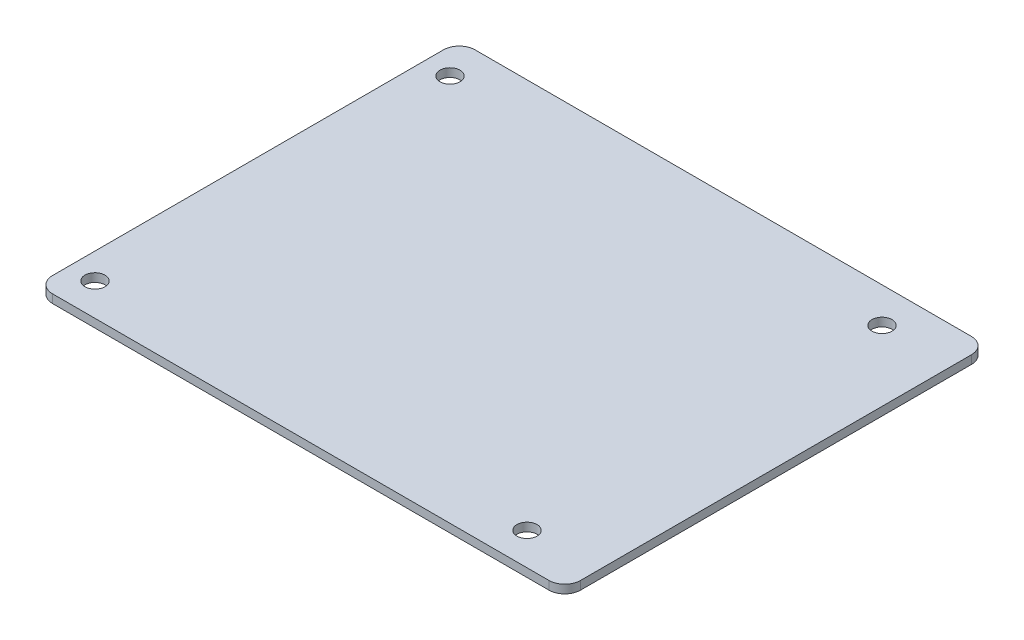
ISO-10303-21;
HEADER;
FILE_DESCRIPTION(('STEP AP214'),'2;1');
FILE_NAME('part.step','',(''),(''),'','','');
FILE_SCHEMA(('AUTOMOTIVE_DESIGN { 1 0 10303 214 1 1 1 1 }'));
ENDSEC;
DATA;
#1=APPLICATION_CONTEXT('core data for automotive mechanical design processes');
#2=APPLICATION_PROTOCOL_DEFINITION('international standard','automotive_design',2000,#1);
#3=PRODUCT_CONTEXT('',#1,'mechanical');
#4=PRODUCT('Part','Part','',(#3));
#5=PRODUCT_RELATED_PRODUCT_CATEGORY('part','',(#4));
#6=PRODUCT_DEFINITION_FORMATION('','',#4);
#7=PRODUCT_DEFINITION_CONTEXT('part definition',#1,'design');
#8=PRODUCT_DEFINITION('design','',#6,#7);
#9=PRODUCT_DEFINITION_SHAPE('','',#8);
#10=(LENGTH_UNIT() NAMED_UNIT(*) SI_UNIT(.MILLI.,.METRE.));
#11=(NAMED_UNIT(*) PLANE_ANGLE_UNIT() SI_UNIT($,.RADIAN.));
#12=(NAMED_UNIT(*) SI_UNIT($,.STERADIAN.) SOLID_ANGLE_UNIT());
#13=UNCERTAINTY_MEASURE_WITH_UNIT(LENGTH_MEASURE(1.E-05),#10,'distance_accuracy_value','');
#14=(GEOMETRIC_REPRESENTATION_CONTEXT(3) GLOBAL_UNCERTAINTY_ASSIGNED_CONTEXT((#13)) GLOBAL_UNIT_ASSIGNED_CONTEXT((#10,
#11,#12)) REPRESENTATION_CONTEXT('',''));
#15=CARTESIAN_POINT('',(0.,0.,0.));
#16=DIRECTION('',(0.,0.,1.));
#17=DIRECTION('',(1.,0.,0.));
#18=AXIS2_PLACEMENT_3D('',#15,#16,#17);
#19=CARTESIAN_POINT('',(-50.06,0.8,40.06));
#20=DIRECTION('',(1.,0.,0.));
#21=DIRECTION('',(0.,0.,-1.));
#22=AXIS2_PLACEMENT_3D('',#19,#20,#21);
#23=PLANE('',#22);
#24=DIRECTION('',(0.,0.,1.));
#25=VECTOR('',#24,1.);
#26=CARTESIAN_POINT('',(-50.06,0.8,40.06));
#27=LINE('',#26,#25);
#28=CARTESIAN_POINT('',(-50.06,0.8,-37.06));
#29=VERTEX_POINT('',#28);
#30=CARTESIAN_POINT('',(-50.06,0.8,37.06));
#31=VERTEX_POINT('',#30);
#32=EDGE_CURVE('E132',#29,#31,#27,.T.);
#33=ORIENTED_EDGE('',*,*,#32,.F.);
#34=DIRECTION('',(0.,-1.,0.));
#35=VECTOR('',#34,1.);
#36=CARTESIAN_POINT('',(-50.06,0.8,-37.06));
#37=LINE('',#36,#35);
#38=CARTESIAN_POINT('',(-50.06,-0.8,-37.06));
#39=VERTEX_POINT('',#38);
#40=EDGE_CURVE('E116',#29,#39,#37,.T.);
#41=ORIENTED_EDGE('',*,*,#40,.T.);
#42=DIRECTION('',(0.,0.,1.));
#43=VECTOR('',#42,1.);
#44=CARTESIAN_POINT('',(-50.06,-0.8,40.06));
#45=LINE('',#44,#43);
#46=CARTESIAN_POINT('',(-50.06,-0.8,37.06));
#47=VERTEX_POINT('',#46);
#48=EDGE_CURVE('E129',#39,#47,#45,.T.);
#49=ORIENTED_EDGE('',*,*,#48,.T.);
#50=DIRECTION('',(0.,-1.,0.));
#51=VECTOR('',#50,1.);
#52=CARTESIAN_POINT('',(-50.06,0.8,37.06));
#53=LINE('',#52,#51);
#54=EDGE_CURVE('E135',#47,#31,#53,.F.);
#55=ORIENTED_EDGE('',*,*,#54,.T.);
#56=EDGE_LOOP('',(#33,#41,#49,#55));
#57=FACE_BOUND('',#56,.T.);
#58=ADVANCED_FACE('F45',(#57),#23,.F.);
#59=CARTESIAN_POINT('',(50.06,0.8,40.06));
#60=DIRECTION('',(0.,0.,-1.));
#61=DIRECTION('',(-1.,0.,0.));
#62=AXIS2_PLACEMENT_3D('',#59,#60,#61);
#63=PLANE('',#62);
#64=DIRECTION('',(1.,0.,0.));
#65=VECTOR('',#64,1.);
#66=CARTESIAN_POINT('',(50.06,-0.8,40.06));
#67=LINE('',#66,#65);
#68=CARTESIAN_POINT('',(-47.06,-0.8,40.06));
#69=VERTEX_POINT('',#68);
#70=CARTESIAN_POINT('',(47.06,-0.8,40.06));
#71=VERTEX_POINT('',#70);
#72=EDGE_CURVE('E140',#69,#71,#67,.T.);
#73=ORIENTED_EDGE('',*,*,#72,.T.);
#74=DIRECTION('',(0.,-1.,0.));
#75=VECTOR('',#74,1.);
#76=CARTESIAN_POINT('',(47.06,0.8,40.06));
#77=LINE('',#76,#75);
#78=CARTESIAN_POINT('',(47.06,0.8,40.06));
#79=VERTEX_POINT('',#78);
#80=EDGE_CURVE('E11',#71,#79,#77,.F.);
#81=ORIENTED_EDGE('',*,*,#80,.T.);
#82=DIRECTION('',(1.,0.,0.));
#83=VECTOR('',#82,1.);
#84=CARTESIAN_POINT('',(50.06,0.8,40.06));
#85=LINE('',#84,#83);
#86=CARTESIAN_POINT('',(-47.06,0.8,40.06));
#87=VERTEX_POINT('',#86);
#88=EDGE_CURVE('E197',#87,#79,#85,.T.);
#89=ORIENTED_EDGE('',*,*,#88,.F.);
#90=DIRECTION('',(0.,-1.,0.));
#91=VECTOR('',#90,1.);
#92=CARTESIAN_POINT('',(-47.06,0.8,40.06));
#93=LINE('',#92,#91);
#94=EDGE_CURVE('E54',#87,#69,#93,.T.);
#95=ORIENTED_EDGE('',*,*,#94,.T.);
#96=EDGE_LOOP('',(#73,#81,#89,#95));
#97=FACE_BOUND('',#96,.T.);
#98=ADVANCED_FACE('F195',(#97),#63,.F.);
#99=CARTESIAN_POINT('',(50.06,0.8,40.06));
#100=DIRECTION('',(-1.,0.,0.));
#101=DIRECTION('',(0.,0.,1.));
#102=AXIS2_PLACEMENT_3D('',#99,#100,#101);
#103=PLANE('',#102);
#104=DIRECTION('',(0.,0.,-1.));
#105=VECTOR('',#104,1.);
#106=CARTESIAN_POINT('',(50.06,-0.8,40.06));
#107=LINE('',#106,#105);
#108=CARTESIAN_POINT('',(50.06,-0.8,37.06));
#109=VERTEX_POINT('',#108);
#110=CARTESIAN_POINT('',(50.06,-0.8,-37.06));
#111=VERTEX_POINT('',#110);
#112=EDGE_CURVE('E146',#109,#111,#107,.T.);
#113=ORIENTED_EDGE('',*,*,#112,.T.);
#114=DIRECTION('',(0.,-1.,0.));
#115=VECTOR('',#114,1.);
#116=CARTESIAN_POINT('',(50.06,0.8,-37.06));
#117=LINE('',#116,#115);
#118=CARTESIAN_POINT('',(50.06,0.8,-37.06));
#119=VERTEX_POINT('',#118);
#120=EDGE_CURVE('E61',#111,#119,#117,.F.);
#121=ORIENTED_EDGE('',*,*,#120,.T.);
#122=DIRECTION('',(0.,0.,-1.));
#123=VECTOR('',#122,1.);
#124=CARTESIAN_POINT('',(50.06,0.8,40.06));
#125=LINE('',#124,#123);
#126=CARTESIAN_POINT('',(50.06,0.8,37.06));
#127=VERTEX_POINT('',#126);
#128=EDGE_CURVE('E205',#127,#119,#125,.T.);
#129=ORIENTED_EDGE('',*,*,#128,.F.);
#130=DIRECTION('',(0.,-1.,0.));
#131=VECTOR('',#130,1.);
#132=CARTESIAN_POINT('',(50.06,0.8,37.06));
#133=LINE('',#132,#131);
#134=EDGE_CURVE('E185',#127,#109,#133,.T.);
#135=ORIENTED_EDGE('',*,*,#134,.T.);
#136=EDGE_LOOP('',(#113,#121,#129,#135));
#137=FACE_BOUND('',#136,.T.);
#138=ADVANCED_FACE('F204',(#137),#103,.F.);
#139=CARTESIAN_POINT('',(50.06,0.8,-40.06));
#140=DIRECTION('',(0.,0.,1.));
#141=DIRECTION('',(1.,0.,0.));
#142=AXIS2_PLACEMENT_3D('',#139,#140,#141);
#143=PLANE('',#142);
#144=DIRECTION('',(-1.,0.,0.));
#145=VECTOR('',#144,1.);
#146=CARTESIAN_POINT('',(50.06,-0.8,-40.06));
#147=LINE('',#146,#145);
#148=CARTESIAN_POINT('',(47.06,-0.8,-40.06));
#149=VERTEX_POINT('',#148);
#150=CARTESIAN_POINT('',(-47.06,-0.8,-40.06));
#151=VERTEX_POINT('',#150);
#152=EDGE_CURVE('E157',#149,#151,#147,.T.);
#153=ORIENTED_EDGE('',*,*,#152,.T.);
#154=DIRECTION('',(0.,-1.,0.));
#155=VECTOR('',#154,1.);
#156=CARTESIAN_POINT('',(-47.06,0.8,-40.06));
#157=LINE('',#156,#155);
#158=CARTESIAN_POINT('',(-47.06,0.8,-40.06));
#159=VERTEX_POINT('',#158);
#160=EDGE_CURVE('E117',#151,#159,#157,.F.);
#161=ORIENTED_EDGE('',*,*,#160,.T.);
#162=DIRECTION('',(-1.,0.,0.));
#163=VECTOR('',#162,1.);
#164=CARTESIAN_POINT('',(50.06,0.8,-40.06));
#165=LINE('',#164,#163);
#166=CARTESIAN_POINT('',(47.06,0.8,-40.06));
#167=VERTEX_POINT('',#166);
#168=EDGE_CURVE('E152',#167,#159,#165,.T.);
#169=ORIENTED_EDGE('',*,*,#168,.F.);
#170=DIRECTION('',(0.,-1.,0.));
#171=VECTOR('',#170,1.);
#172=CARTESIAN_POINT('',(47.06,0.8,-40.06));
#173=LINE('',#172,#171);
#174=EDGE_CURVE('E123',#167,#149,#173,.T.);
#175=ORIENTED_EDGE('',*,*,#174,.T.);
#176=EDGE_LOOP('',(#153,#161,#169,#175));
#177=FACE_BOUND('',#176,.T.);
#178=ADVANCED_FACE('F294',(#177),#143,.F.);
#179=CARTESIAN_POINT('',(0.,0.8,0.));
#180=DIRECTION('',(0.,1.,0.));
#181=DIRECTION('',(0.,0.,1.));
#182=AXIS2_PLACEMENT_3D('',#179,#180,#181);
#183=PLANE('',#182);
#184=CARTESIAN_POINT('',(36.76,0.8,-33.3925));
#185=DIRECTION('',(0.,1.,0.));
#186=DIRECTION('',(0.,0.,1.));
#187=AXIS2_PLACEMENT_3D('',#184,#185,#186);
#188=CIRCLE('',#187,1.905);
#189=CARTESIAN_POINT('',(36.76,0.8,-31.4875));
#190=VERTEX_POINT('',#189);
#191=EDGE_CURVE('E219',#190,#190,#188,.T.);
#192=ORIENTED_EDGE('',*,*,#191,.F.);
#193=EDGE_LOOP('',(#192));
#194=FACE_BOUND('',#193,.T.);
#195=CARTESIAN_POINT('',(36.76,0.8,33.9175));
#196=DIRECTION('',(0.,1.,0.));
#197=DIRECTION('',(0.,0.,1.));
#198=AXIS2_PLACEMENT_3D('',#195,#196,#197);
#199=CIRCLE('',#198,1.905);
#200=CARTESIAN_POINT('',(36.76,0.8,35.8225));
#201=VERTEX_POINT('',#200);
#202=EDGE_CURVE('E228',#201,#201,#199,.T.);
#203=ORIENTED_EDGE('',*,*,#202,.F.);
#204=EDGE_LOOP('',(#203));
#205=FACE_BOUND('',#204,.T.);
#206=CARTESIAN_POINT('',(-45.155,0.8,33.9175));
#207=DIRECTION('',(0.,1.,0.));
#208=DIRECTION('',(0.,0.,1.));
#209=AXIS2_PLACEMENT_3D('',#206,#207,#208);
#210=CIRCLE('',#209,1.905);
#211=CARTESIAN_POINT('',(-45.155,0.8,35.8225));
#212=VERTEX_POINT('',#211);
#213=EDGE_CURVE('E218',#212,#212,#210,.T.);
#214=ORIENTED_EDGE('',*,*,#213,.F.);
#215=EDGE_LOOP('',(#214));
#216=FACE_BOUND('',#215,.T.);
#217=CARTESIAN_POINT('',(-45.155,0.8,-33.3925));
#218=DIRECTION('',(0.,1.,0.));
#219=DIRECTION('',(0.,0.,1.));
#220=AXIS2_PLACEMENT_3D('',#217,#218,#219);
#221=CIRCLE('',#220,1.905);
#222=CARTESIAN_POINT('',(-45.155,0.8,-31.4875));
#223=VERTEX_POINT('',#222);
#224=EDGE_CURVE('E149',#223,#223,#221,.T.);
#225=ORIENTED_EDGE('',*,*,#224,.F.);
#226=EDGE_LOOP('',(#225));
#227=FACE_BOUND('',#226,.T.);
#228=ORIENTED_EDGE('',*,*,#168,.T.);
#229=CARTESIAN_POINT('',(-47.06,0.8,-37.06));
#230=DIRECTION('',(0.,1.,0.));
#231=DIRECTION('',(0.,0.,1.));
#232=AXIS2_PLACEMENT_3D('',#229,#230,#231);
#233=CIRCLE('',#232,3.);
#234=EDGE_CURVE('E182',#159,#29,#233,.T.);
#235=ORIENTED_EDGE('',*,*,#234,.T.);
#236=ORIENTED_EDGE('',*,*,#32,.T.);
#237=CARTESIAN_POINT('',(-47.06,0.8,37.06));
#238=DIRECTION('',(0.,1.,0.));
#239=DIRECTION('',(0.,0.,1.));
#240=AXIS2_PLACEMENT_3D('',#237,#238,#239);
#241=CIRCLE('',#240,3.);
#242=EDGE_CURVE('E174',#31,#87,#241,.T.);
#243=ORIENTED_EDGE('',*,*,#242,.T.);
#244=ORIENTED_EDGE('',*,*,#88,.T.);
#245=CARTESIAN_POINT('',(47.06,0.8,37.06));
#246=DIRECTION('',(0.,1.,0.));
#247=DIRECTION('',(0.,0.,1.));
#248=AXIS2_PLACEMENT_3D('',#245,#246,#247);
#249=CIRCLE('',#248,3.);
#250=EDGE_CURVE('E68',#79,#127,#249,.T.);
#251=ORIENTED_EDGE('',*,*,#250,.T.);
#252=ORIENTED_EDGE('',*,*,#128,.T.);
#253=CARTESIAN_POINT('',(47.06,0.8,-37.06));
#254=DIRECTION('',(0.,1.,0.));
#255=DIRECTION('',(0.,0.,1.));
#256=AXIS2_PLACEMENT_3D('',#253,#254,#255);
#257=CIRCLE('',#256,3.);
#258=EDGE_CURVE('E179',#119,#167,#257,.T.);
#259=ORIENTED_EDGE('',*,*,#258,.T.);
#260=EDGE_LOOP('',(#228,#235,#236,#243,#244,#251,#252,#259));
#261=FACE_BOUND('',#260,.T.);
#262=ADVANCED_FACE('F247',(#194,#205,#216,#227,#261),#183,.T.);
#263=CARTESIAN_POINT('',(0.,-0.8,0.));
#264=DIRECTION('',(0.,1.,0.));
#265=DIRECTION('',(0.,0.,1.));
#266=AXIS2_PLACEMENT_3D('',#263,#264,#265);
#267=PLANE('',#266);
#268=CARTESIAN_POINT('',(36.76,-0.8,-33.3925));
#269=DIRECTION('',(0.,1.,0.));
#270=DIRECTION('',(0.,0.,1.));
#271=AXIS2_PLACEMENT_3D('',#268,#269,#270);
#272=CIRCLE('',#271,1.905);
#273=CARTESIAN_POINT('',(36.76,-0.8,-31.4875));
#274=VERTEX_POINT('',#273);
#275=EDGE_CURVE('E224',#274,#274,#272,.F.);
#276=ORIENTED_EDGE('',*,*,#275,.F.);
#277=EDGE_LOOP('',(#276));
#278=FACE_BOUND('',#277,.T.);
#279=CARTESIAN_POINT('',(36.76,-0.8,33.9175));
#280=DIRECTION('',(0.,1.,0.));
#281=DIRECTION('',(0.,0.,1.));
#282=AXIS2_PLACEMENT_3D('',#279,#280,#281);
#283=CIRCLE('',#282,1.905);
#284=CARTESIAN_POINT('',(36.76,-0.8,35.8225));
#285=VERTEX_POINT('',#284);
#286=EDGE_CURVE('E223',#285,#285,#283,.F.);
#287=ORIENTED_EDGE('',*,*,#286,.F.);
#288=EDGE_LOOP('',(#287));
#289=FACE_BOUND('',#288,.T.);
#290=CARTESIAN_POINT('',(-45.155,-0.8,33.9175));
#291=DIRECTION('',(0.,1.,0.));
#292=DIRECTION('',(0.,0.,1.));
#293=AXIS2_PLACEMENT_3D('',#290,#291,#292);
#294=CIRCLE('',#293,1.905);
#295=CARTESIAN_POINT('',(-45.155,-0.8,35.8225));
#296=VERTEX_POINT('',#295);
#297=EDGE_CURVE('E232',#296,#296,#294,.F.);
#298=ORIENTED_EDGE('',*,*,#297,.F.);
#299=EDGE_LOOP('',(#298));
#300=FACE_BOUND('',#299,.T.);
#301=CARTESIAN_POINT('',(-45.155,-0.8,-33.3925));
#302=DIRECTION('',(0.,1.,0.));
#303=DIRECTION('',(0.,0.,1.));
#304=AXIS2_PLACEMENT_3D('',#301,#302,#303);
#305=CIRCLE('',#304,1.905);
#306=CARTESIAN_POINT('',(-45.155,-0.8,-31.4875));
#307=VERTEX_POINT('',#306);
#308=EDGE_CURVE('E141',#307,#307,#305,.F.);
#309=ORIENTED_EDGE('',*,*,#308,.F.);
#310=EDGE_LOOP('',(#309));
#311=FACE_BOUND('',#310,.T.);
#312=ORIENTED_EDGE('',*,*,#48,.F.);
#313=CARTESIAN_POINT('',(-47.06,-0.8,-37.06));
#314=DIRECTION('',(0.,1.,0.));
#315=DIRECTION('',(0.,0.,1.));
#316=AXIS2_PLACEMENT_3D('',#313,#314,#315);
#317=CIRCLE('',#316,3.);
#318=EDGE_CURVE('E112',#39,#151,#317,.F.);
#319=ORIENTED_EDGE('',*,*,#318,.T.);
#320=ORIENTED_EDGE('',*,*,#152,.F.);
#321=CARTESIAN_POINT('',(47.06,-0.8,-37.06));
#322=DIRECTION('',(0.,1.,0.));
#323=DIRECTION('',(0.,0.,1.));
#324=AXIS2_PLACEMENT_3D('',#321,#322,#323);
#325=CIRCLE('',#324,3.);
#326=EDGE_CURVE('E124',#149,#111,#325,.F.);
#327=ORIENTED_EDGE('',*,*,#326,.T.);
#328=ORIENTED_EDGE('',*,*,#112,.F.);
#329=CARTESIAN_POINT('',(47.06,-0.8,37.06));
#330=DIRECTION('',(0.,1.,0.));
#331=DIRECTION('',(0.,0.,1.));
#332=AXIS2_PLACEMENT_3D('',#329,#330,#331);
#333=CIRCLE('',#332,3.);
#334=EDGE_CURVE('E164',#109,#71,#333,.F.);
#335=ORIENTED_EDGE('',*,*,#334,.T.);
#336=ORIENTED_EDGE('',*,*,#72,.F.);
#337=CARTESIAN_POINT('',(-47.06,-0.8,37.06));
#338=DIRECTION('',(0.,1.,0.));
#339=DIRECTION('',(0.,0.,1.));
#340=AXIS2_PLACEMENT_3D('',#337,#338,#339);
#341=CIRCLE('',#340,3.);
#342=EDGE_CURVE('E134',#69,#47,#341,.F.);
#343=ORIENTED_EDGE('',*,*,#342,.T.);
#344=EDGE_LOOP('',(#312,#319,#320,#327,#328,#335,#336,#343));
#345=FACE_BOUND('',#344,.T.);
#346=ADVANCED_FACE('F137',(#278,#289,#300,#311,#345),#267,.F.);
#347=CARTESIAN_POINT('',(-47.06,0.8,-37.06));
#348=DIRECTION('',(0.,-1.,0.));
#349=DIRECTION('',(0.,0.,-1.));
#350=AXIS2_PLACEMENT_3D('',#347,#348,#349);
#351=CYLINDRICAL_SURFACE('',#350,3.);
#352=ORIENTED_EDGE('',*,*,#234,.F.);
#353=ORIENTED_EDGE('',*,*,#160,.F.);
#354=ORIENTED_EDGE('',*,*,#318,.F.);
#355=ORIENTED_EDGE('',*,*,#40,.F.);
#356=EDGE_LOOP('',(#352,#353,#354,#355));
#357=FACE_BOUND('',#356,.T.);
#358=ADVANCED_FACE('F115',(#357),#351,.T.);
#359=CARTESIAN_POINT('',(47.06,0.8,-37.06));
#360=DIRECTION('',(0.,-1.,0.));
#361=DIRECTION('',(0.,0.,-1.));
#362=AXIS2_PLACEMENT_3D('',#359,#360,#361);
#363=CYLINDRICAL_SURFACE('',#362,3.);
#364=ORIENTED_EDGE('',*,*,#258,.F.);
#365=ORIENTED_EDGE('',*,*,#120,.F.);
#366=ORIENTED_EDGE('',*,*,#326,.F.);
#367=ORIENTED_EDGE('',*,*,#174,.F.);
#368=EDGE_LOOP('',(#364,#365,#366,#367));
#369=FACE_BOUND('',#368,.T.);
#370=ADVANCED_FACE('F275',(#369),#363,.T.);
#371=CARTESIAN_POINT('',(47.06,0.8,37.06));
#372=DIRECTION('',(0.,-1.,0.));
#373=DIRECTION('',(0.,0.,-1.));
#374=AXIS2_PLACEMENT_3D('',#371,#372,#373);
#375=CYLINDRICAL_SURFACE('',#374,3.);
#376=ORIENTED_EDGE('',*,*,#250,.F.);
#377=ORIENTED_EDGE('',*,*,#80,.F.);
#378=ORIENTED_EDGE('',*,*,#334,.F.);
#379=ORIENTED_EDGE('',*,*,#134,.F.);
#380=EDGE_LOOP('',(#376,#377,#378,#379));
#381=FACE_BOUND('',#380,.T.);
#382=ADVANCED_FACE('F203',(#381),#375,.T.);
#383=CARTESIAN_POINT('',(-47.06,0.8,37.06));
#384=DIRECTION('',(0.,-1.,0.));
#385=DIRECTION('',(0.,0.,-1.));
#386=AXIS2_PLACEMENT_3D('',#383,#384,#385);
#387=CYLINDRICAL_SURFACE('',#386,3.);
#388=ORIENTED_EDGE('',*,*,#242,.F.);
#389=ORIENTED_EDGE('',*,*,#54,.F.);
#390=ORIENTED_EDGE('',*,*,#342,.F.);
#391=ORIENTED_EDGE('',*,*,#94,.F.);
#392=EDGE_LOOP('',(#388,#389,#390,#391));
#393=FACE_BOUND('',#392,.T.);
#394=ADVANCED_FACE('F47',(#393),#387,.T.);
#395=CARTESIAN_POINT('',(-45.155,-0.801,-33.3925));
#396=DIRECTION('',(0.,1.,0.));
#397=DIRECTION('',(0.,0.,1.));
#398=AXIS2_PLACEMENT_3D('',#395,#396,#397);
#399=CYLINDRICAL_SURFACE('',#398,1.905);
#400=ORIENTED_EDGE('',*,*,#224,.T.);
#401=EDGE_LOOP('',(#400));
#402=FACE_BOUND('',#401,.T.);
#403=ORIENTED_EDGE('',*,*,#308,.T.);
#404=EDGE_LOOP('',(#403));
#405=FACE_BOUND('',#404,.T.);
#406=ADVANCED_FACE('F252',(#402,#405),#399,.F.);
#407=CARTESIAN_POINT('',(-45.155,-0.801,33.9175));
#408=DIRECTION('',(0.,1.,0.));
#409=DIRECTION('',(0.,0.,1.));
#410=AXIS2_PLACEMENT_3D('',#407,#408,#409);
#411=CYLINDRICAL_SURFACE('',#410,1.905);
#412=ORIENTED_EDGE('',*,*,#213,.T.);
#413=EDGE_LOOP('',(#412));
#414=FACE_BOUND('',#413,.T.);
#415=ORIENTED_EDGE('',*,*,#297,.T.);
#416=EDGE_LOOP('',(#415));
#417=FACE_BOUND('',#416,.T.);
#418=ADVANCED_FACE('F243',(#414,#417),#411,.F.);
#419=CARTESIAN_POINT('',(36.76,-0.801,33.9175));
#420=DIRECTION('',(0.,1.,0.));
#421=DIRECTION('',(0.,0.,1.));
#422=AXIS2_PLACEMENT_3D('',#419,#420,#421);
#423=CYLINDRICAL_SURFACE('',#422,1.905);
#424=ORIENTED_EDGE('',*,*,#202,.T.);
#425=EDGE_LOOP('',(#424));
#426=FACE_BOUND('',#425,.T.);
#427=ORIENTED_EDGE('',*,*,#286,.T.);
#428=EDGE_LOOP('',(#427));
#429=FACE_BOUND('',#428,.T.);
#430=ADVANCED_FACE('F259',(#426,#429),#423,.F.);
#431=CARTESIAN_POINT('',(36.76,-0.801,-33.3925));
#432=DIRECTION('',(0.,1.,0.));
#433=DIRECTION('',(0.,0.,1.));
#434=AXIS2_PLACEMENT_3D('',#431,#432,#433);
#435=CYLINDRICAL_SURFACE('',#434,1.905);
#436=ORIENTED_EDGE('',*,*,#191,.T.);
#437=EDGE_LOOP('',(#436));
#438=FACE_BOUND('',#437,.T.);
#439=ORIENTED_EDGE('',*,*,#275,.T.);
#440=EDGE_LOOP('',(#439));
#441=FACE_BOUND('',#440,.T.);
#442=ADVANCED_FACE('F333',(#438,#441),#435,.F.);
#443=CLOSED_SHELL('',(#58,#98,#138,#178,#262,#346,#358,#370,#382,#394,#406,#418,#430,#442));
#444=MANIFOLD_SOLID_BREP('B2',#443);
#445=ADVANCED_BREP_SHAPE_REPRESENTATION('',(#18,#444),#14);
#446=SHAPE_DEFINITION_REPRESENTATION(#9,#445);
ENDSEC;
END-ISO-10303-21;
